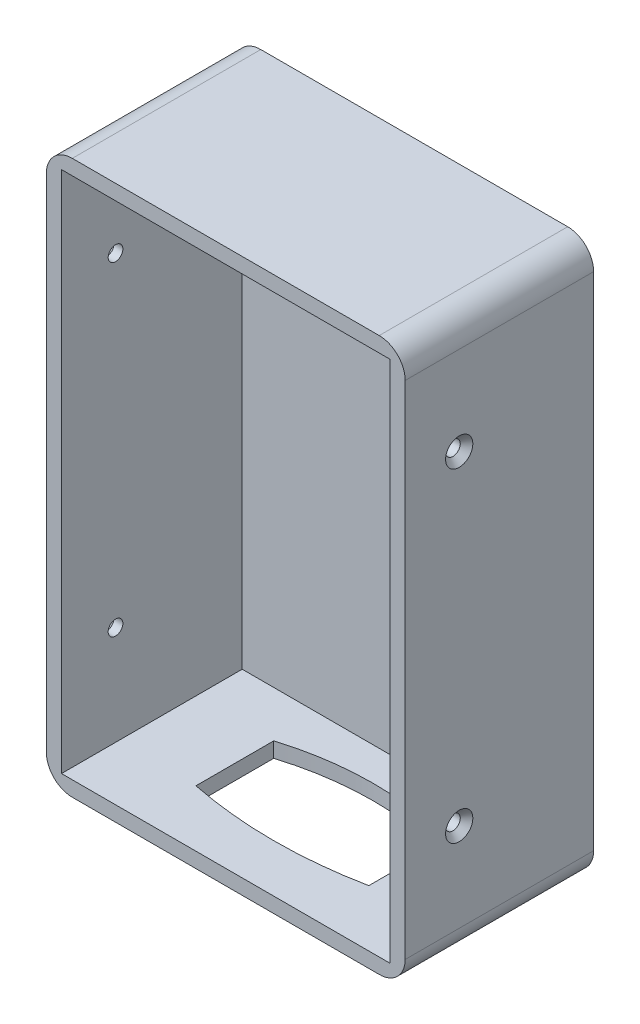
ISO-10303-21;
HEADER;
FILE_DESCRIPTION(('STEP AP214'),'2;1');
FILE_NAME('part.step','',(''),(''),'','','');
FILE_SCHEMA(('AUTOMOTIVE_DESIGN { 1 0 10303 214 1 1 1 1 }'));
ENDSEC;
DATA;
#1=APPLICATION_CONTEXT('core data for automotive mechanical design processes');
#2=APPLICATION_PROTOCOL_DEFINITION('international standard','automotive_design',2000,#1);
#3=PRODUCT_CONTEXT('',#1,'mechanical');
#4=PRODUCT('Part','Part','',(#3));
#5=PRODUCT_RELATED_PRODUCT_CATEGORY('part','',(#4));
#6=PRODUCT_DEFINITION_FORMATION('','',#4);
#7=PRODUCT_DEFINITION_CONTEXT('part definition',#1,'design');
#8=PRODUCT_DEFINITION('design','',#6,#7);
#9=PRODUCT_DEFINITION_SHAPE('','',#8);
#10=(LENGTH_UNIT() NAMED_UNIT(*) SI_UNIT(.MILLI.,.METRE.));
#11=(NAMED_UNIT(*) PLANE_ANGLE_UNIT() SI_UNIT($,.RADIAN.));
#12=(NAMED_UNIT(*) SI_UNIT($,.STERADIAN.) SOLID_ANGLE_UNIT());
#13=UNCERTAINTY_MEASURE_WITH_UNIT(LENGTH_MEASURE(1.E-05),#10,'distance_accuracy_value','');
#14=(GEOMETRIC_REPRESENTATION_CONTEXT(3) GLOBAL_UNCERTAINTY_ASSIGNED_CONTEXT((#13)) GLOBAL_UNIT_ASSIGNED_CONTEXT((#10,
#11,#12)) REPRESENTATION_CONTEXT('',''));
#15=CARTESIAN_POINT('',(0.,0.,0.));
#16=DIRECTION('',(0.,0.,1.));
#17=DIRECTION('',(1.,0.,0.));
#18=AXIS2_PLACEMENT_3D('',#15,#16,#17);
#19=CARTESIAN_POINT('',(-41.5,58.,43.6));
#20=DIRECTION('',(1.,0.,0.));
#21=DIRECTION('',(0.,0.,-1.));
#22=AXIS2_PLACEMENT_3D('',#19,#20,#21);
#23=PLANE('',#22);
#24=DIRECTION('',(0.,-1.,0.));
#25=VECTOR('',#24,1.);
#26=CARTESIAN_POINT('',(-41.5,58.,0.));
#27=LINE('',#26,#25);
#28=CARTESIAN_POINT('',(-41.5,58.,0.));
#29=VERTEX_POINT('',#28);
#30=CARTESIAN_POINT('',(-41.5,-58.,0.));
#31=VERTEX_POINT('',#30);
#32=EDGE_CURVE('E343',#29,#31,#27,.T.);
#33=ORIENTED_EDGE('',*,*,#32,.T.);
#34=DIRECTION('',(0.,0.,-1.));
#35=VECTOR('',#34,1.);
#36=CARTESIAN_POINT('',(-41.5,-58.,43.6));
#37=LINE('',#36,#35);
#38=CARTESIAN_POINT('',(-41.5,-58.,43.6));
#39=VERTEX_POINT('',#38);
#40=EDGE_CURVE('E357',#39,#31,#37,.T.);
#41=ORIENTED_EDGE('',*,*,#40,.F.);
#42=DIRECTION('',(0.,-1.,0.));
#43=VECTOR('',#42,1.);
#44=CARTESIAN_POINT('',(-41.5,58.,43.6));
#45=LINE('',#44,#43);
#46=CARTESIAN_POINT('',(-41.5,58.,43.6));
#47=VERTEX_POINT('',#46);
#48=EDGE_CURVE('E355',#47,#39,#45,.T.);
#49=ORIENTED_EDGE('',*,*,#48,.F.);
#50=DIRECTION('',(0.,0.,-1.));
#51=VECTOR('',#50,1.);
#52=CARTESIAN_POINT('',(-41.5,58.,43.6));
#53=LINE('',#52,#51);
#54=EDGE_CURVE('E375',#47,#29,#53,.T.);
#55=ORIENTED_EDGE('',*,*,#54,.T.);
#56=EDGE_LOOP('',(#33,#41,#49,#55));
#57=FACE_BOUND('',#56,.T.);
#58=CARTESIAN_POINT('',(-41.5,37.5,31.1));
#59=DIRECTION('',(-1.,0.,0.));
#60=DIRECTION('',(0.,0.,1.));
#61=AXIS2_PLACEMENT_3D('',#58,#59,#60);
#62=CIRCLE('',#61,3.15);
#63=CARTESIAN_POINT('',(-41.5,37.5,34.25));
#64=VERTEX_POINT('',#63);
#65=EDGE_CURVE('E250',#64,#64,#62,.T.);
#66=ORIENTED_EDGE('',*,*,#65,.F.);
#67=EDGE_LOOP('',(#66));
#68=FACE_BOUND('',#67,.T.);
#69=CARTESIAN_POINT('',(-41.5,-37.5,31.1));
#70=DIRECTION('',(-1.,0.,0.));
#71=DIRECTION('',(0.,0.,1.));
#72=AXIS2_PLACEMENT_3D('',#69,#70,#71);
#73=CIRCLE('',#72,3.15);
#74=CARTESIAN_POINT('',(-41.5,-37.5,34.25));
#75=VERTEX_POINT('',#74);
#76=EDGE_CURVE('E231',#75,#75,#73,.T.);
#77=ORIENTED_EDGE('',*,*,#76,.F.);
#78=EDGE_LOOP('',(#77));
#79=FACE_BOUND('',#78,.T.);
#80=ADVANCED_FACE('F33',(#57,#68,#79),#23,.F.);
#81=CARTESIAN_POINT('',(41.5,58.,43.6));
#82=DIRECTION('',(-1.,0.,0.));
#83=DIRECTION('',(0.,-1.,0.));
#84=AXIS2_PLACEMENT_3D('',#81,#82,#83);
#85=PLANE('',#84);
#86=CARTESIAN_POINT('',(41.5,37.5,31.1));
#87=DIRECTION('',(1.,0.,0.));
#88=DIRECTION('',(0.,0.,-1.));
#89=AXIS2_PLACEMENT_3D('',#86,#87,#88);
#90=CIRCLE('',#89,3.15);
#91=CARTESIAN_POINT('',(41.5,37.5,27.95));
#92=VERTEX_POINT('',#91);
#93=EDGE_CURVE('E268',#92,#92,#90,.T.);
#94=ORIENTED_EDGE('',*,*,#93,.F.);
#95=EDGE_LOOP('',(#94));
#96=FACE_BOUND('',#95,.T.);
#97=DIRECTION('',(0.,1.,0.));
#98=VECTOR('',#97,1.);
#99=CARTESIAN_POINT('',(41.5,58.,0.));
#100=LINE('',#99,#98);
#101=CARTESIAN_POINT('',(41.5,-58.,0.));
#102=VERTEX_POINT('',#101);
#103=CARTESIAN_POINT('',(41.5,58.,0.));
#104=VERTEX_POINT('',#103);
#105=EDGE_CURVE('E364',#102,#104,#100,.T.);
#106=ORIENTED_EDGE('',*,*,#105,.T.);
#107=DIRECTION('',(0.,0.,-1.));
#108=VECTOR('',#107,1.);
#109=CARTESIAN_POINT('',(41.5,58.,43.6));
#110=LINE('',#109,#108);
#111=CARTESIAN_POINT('',(41.5,58.,43.6));
#112=VERTEX_POINT('',#111);
#113=EDGE_CURVE('E384',#112,#104,#110,.T.);
#114=ORIENTED_EDGE('',*,*,#113,.F.);
#115=DIRECTION('',(0.,1.,0.));
#116=VECTOR('',#115,1.);
#117=CARTESIAN_POINT('',(41.5,58.,43.6));
#118=LINE('',#117,#116);
#119=CARTESIAN_POINT('',(41.5,-58.,43.6));
#120=VERTEX_POINT('',#119);
#121=EDGE_CURVE('E347',#120,#112,#118,.T.);
#122=ORIENTED_EDGE('',*,*,#121,.F.);
#123=DIRECTION('',(0.,0.,-1.));
#124=VECTOR('',#123,1.);
#125=CARTESIAN_POINT('',(41.5,-58.,43.6));
#126=LINE('',#125,#124);
#127=EDGE_CURVE('E387',#120,#102,#126,.T.);
#128=ORIENTED_EDGE('',*,*,#127,.T.);
#129=EDGE_LOOP('',(#106,#114,#122,#128));
#130=FACE_BOUND('',#129,.T.);
#131=CARTESIAN_POINT('',(41.5,-37.5,31.1));
#132=DIRECTION('',(1.,0.,0.));
#133=DIRECTION('',(0.,0.,-1.));
#134=AXIS2_PLACEMENT_3D('',#131,#132,#133);
#135=CIRCLE('',#134,3.15);
#136=CARTESIAN_POINT('',(41.5,-37.5,27.95));
#137=VERTEX_POINT('',#136);
#138=EDGE_CURVE('E259',#137,#137,#135,.T.);
#139=ORIENTED_EDGE('',*,*,#138,.F.);
#140=EDGE_LOOP('',(#139));
#141=FACE_BOUND('',#140,.T.);
#142=ADVANCED_FACE('F448',(#96,#130,#141),#85,.F.);
#143=CARTESIAN_POINT('',(-35.5,-58.,43.6));
#144=DIRECTION('',(0.,0.,1.));
#145=DIRECTION('',(1.,0.,0.));
#146=AXIS2_PLACEMENT_3D('',#143,#144,#145);
#147=PLANE('',#146);
#148=CARTESIAN_POINT('',(-35.5,-58.,43.6));
#149=DIRECTION('',(0.,0.,1.));
#150=DIRECTION('',(1.,0.,0.));
#151=AXIS2_PLACEMENT_3D('',#148,#149,#150);
#152=CIRCLE('',#151,6.);
#153=CARTESIAN_POINT('',(-35.5,-64.,43.6));
#154=VERTEX_POINT('',#153);
#155=EDGE_CURVE('E339',#39,#154,#152,.T.);
#156=ORIENTED_EDGE('',*,*,#155,.T.);
#157=DIRECTION('',(1.,0.,0.));
#158=VECTOR('',#157,1.);
#159=CARTESIAN_POINT('',(-35.5,-64.,43.6));
#160=LINE('',#159,#158);
#161=CARTESIAN_POINT('',(35.5,-64.,43.6));
#162=VERTEX_POINT('',#161);
#163=EDGE_CURVE('E342',#154,#162,#160,.T.);
#164=ORIENTED_EDGE('',*,*,#163,.T.);
#165=CARTESIAN_POINT('',(35.5,-58.,43.6));
#166=DIRECTION('',(0.,0.,1.));
#167=DIRECTION('',(1.,0.,0.));
#168=AXIS2_PLACEMENT_3D('',#165,#166,#167);
#169=CIRCLE('',#168,6.);
#170=EDGE_CURVE('E345',#162,#120,#169,.T.);
#171=ORIENTED_EDGE('',*,*,#170,.T.);
#172=ORIENTED_EDGE('',*,*,#121,.T.);
#173=CARTESIAN_POINT('',(35.5,58.,43.6));
#174=DIRECTION('',(0.,0.,1.));
#175=DIRECTION('',(1.,0.,0.));
#176=AXIS2_PLACEMENT_3D('',#173,#174,#175);
#177=CIRCLE('',#176,5.99999999999999);
#178=CARTESIAN_POINT('',(35.5,64.,43.6));
#179=VERTEX_POINT('',#178);
#180=EDGE_CURVE('E349',#112,#179,#177,.T.);
#181=ORIENTED_EDGE('',*,*,#180,.T.);
#182=DIRECTION('',(-1.,0.,0.));
#183=VECTOR('',#182,1.);
#184=CARTESIAN_POINT('',(-35.5,64.,43.6));
#185=LINE('',#184,#183);
#186=CARTESIAN_POINT('',(-35.5,64.,43.6));
#187=VERTEX_POINT('',#186);
#188=EDGE_CURVE('E351',#179,#187,#185,.T.);
#189=ORIENTED_EDGE('',*,*,#188,.T.);
#190=CARTESIAN_POINT('',(-35.5,58.,43.6));
#191=DIRECTION('',(0.,0.,1.));
#192=DIRECTION('',(-1.,0.,0.));
#193=AXIS2_PLACEMENT_3D('',#190,#191,#192);
#194=CIRCLE('',#193,5.99999999999999);
#195=EDGE_CURVE('E353',#187,#47,#194,.T.);
#196=ORIENTED_EDGE('',*,*,#195,.T.);
#197=ORIENTED_EDGE('',*,*,#48,.T.);
#198=EDGE_LOOP('',(#156,#164,#171,#172,#181,#189,#196,#197));
#199=FACE_BOUND('',#198,.T.);
#200=DIRECTION('',(-1.,0.,0.));
#201=VECTOR('',#200,1.);
#202=CARTESIAN_POINT('',(-38.,60.5,43.6));
#203=LINE('',#202,#201);
#204=CARTESIAN_POINT('',(38.,60.5,43.6));
#205=VERTEX_POINT('',#204);
#206=CARTESIAN_POINT('',(-38.,60.5,43.6));
#207=VERTEX_POINT('',#206);
#208=EDGE_CURVE('E320',#205,#207,#203,.T.);
#209=ORIENTED_EDGE('',*,*,#208,.F.);
#210=DIRECTION('',(0.,1.,0.));
#211=VECTOR('',#210,1.);
#212=CARTESIAN_POINT('',(38.,60.5,43.6));
#213=LINE('',#212,#211);
#214=CARTESIAN_POINT('',(38.,-60.5,43.6));
#215=VERTEX_POINT('',#214);
#216=EDGE_CURVE('E318',#215,#205,#213,.T.);
#217=ORIENTED_EDGE('',*,*,#216,.F.);
#218=DIRECTION('',(1.,0.,0.));
#219=VECTOR('',#218,1.);
#220=CARTESIAN_POINT('',(-38.,-60.5,43.6));
#221=LINE('',#220,#219);
#222=CARTESIAN_POINT('',(-38.,-60.5,43.6));
#223=VERTEX_POINT('',#222);
#224=EDGE_CURVE('E325',#223,#215,#221,.T.);
#225=ORIENTED_EDGE('',*,*,#224,.F.);
#226=DIRECTION('',(0.,-1.,0.));
#227=VECTOR('',#226,1.);
#228=CARTESIAN_POINT('',(-38.,60.5,43.6));
#229=LINE('',#228,#227);
#230=EDGE_CURVE('E322',#207,#223,#229,.T.);
#231=ORIENTED_EDGE('',*,*,#230,.F.);
#232=EDGE_LOOP('',(#209,#217,#225,#231));
#233=FACE_BOUND('',#232,.T.);
#234=ADVANCED_FACE('F454',(#199,#233),#147,.T.);
#235=CARTESIAN_POINT('',(-35.5,-58.,0.));
#236=DIRECTION('',(0.,0.,1.));
#237=DIRECTION('',(1.,0.,0.));
#238=AXIS2_PLACEMENT_3D('',#235,#236,#237);
#239=PLANE('',#238);
#240=DIRECTION('',(-1.,0.,0.));
#241=VECTOR('',#240,1.);
#242=CARTESIAN_POINT('',(7.99999999999999,44.,0.));
#243=LINE('',#242,#241);
#244=CARTESIAN_POINT('',(7.99999999999999,44.,0.));
#245=VERTEX_POINT('',#244);
#246=CARTESIAN_POINT('',(-7.99999999999999,44.,0.));
#247=VERTEX_POINT('',#246);
#248=EDGE_CURVE('E205',#245,#247,#243,.T.);
#249=ORIENTED_EDGE('',*,*,#248,.F.);
#250=CARTESIAN_POINT('',(8.,46.,0.));
#251=DIRECTION('',(0.,0.,-1.));
#252=DIRECTION('',(-1.,0.,0.));
#253=AXIS2_PLACEMENT_3D('',#250,#251,#252);
#254=CIRCLE('',#253,2.);
#255=CARTESIAN_POINT('',(10.,46.,0.));
#256=VERTEX_POINT('',#255);
#257=EDGE_CURVE('E48',#256,#245,#254,.T.);
#258=ORIENTED_EDGE('',*,*,#257,.F.);
#259=DIRECTION('',(0.,-1.,0.));
#260=VECTOR('',#259,1.);
#261=CARTESIAN_POINT('',(10.,52.,0.));
#262=LINE('',#261,#260);
#263=CARTESIAN_POINT('',(10.,52.,0.));
#264=VERTEX_POINT('',#263);
#265=EDGE_CURVE('E226',#264,#256,#262,.T.);
#266=ORIENTED_EDGE('',*,*,#265,.F.);
#267=CARTESIAN_POINT('',(8.,52.,0.));
#268=DIRECTION('',(0.,0.,-1.));
#269=DIRECTION('',(-1.,0.,0.));
#270=AXIS2_PLACEMENT_3D('',#267,#268,#269);
#271=CIRCLE('',#270,2.);
#272=CARTESIAN_POINT('',(7.99999999999999,54.,0.));
#273=VERTEX_POINT('',#272);
#274=EDGE_CURVE('E223',#273,#264,#271,.T.);
#275=ORIENTED_EDGE('',*,*,#274,.F.);
#276=DIRECTION('',(-1.,0.,0.));
#277=VECTOR('',#276,1.);
#278=CARTESIAN_POINT('',(7.99999999999999,54.,0.));
#279=LINE('',#278,#277);
#280=CARTESIAN_POINT('',(-7.99999999999998,54.,0.));
#281=VERTEX_POINT('',#280);
#282=EDGE_CURVE('E220',#273,#281,#279,.T.);
#283=ORIENTED_EDGE('',*,*,#282,.T.);
#284=CARTESIAN_POINT('',(-8.,52.,0.));
#285=DIRECTION('',(0.,0.,1.));
#286=DIRECTION('',(1.,0.,0.));
#287=AXIS2_PLACEMENT_3D('',#284,#285,#286);
#288=CIRCLE('',#287,2.);
#289=CARTESIAN_POINT('',(-10.,52.,0.));
#290=VERTEX_POINT('',#289);
#291=EDGE_CURVE('E215',#281,#290,#288,.T.);
#292=ORIENTED_EDGE('',*,*,#291,.T.);
#293=DIRECTION('',(0.,-1.,0.));
#294=VECTOR('',#293,1.);
#295=CARTESIAN_POINT('',(-10.,52.,0.));
#296=LINE('',#295,#294);
#297=CARTESIAN_POINT('',(-10.,46.,0.));
#298=VERTEX_POINT('',#297);
#299=EDGE_CURVE('E213',#290,#298,#296,.T.);
#300=ORIENTED_EDGE('',*,*,#299,.T.);
#301=CARTESIAN_POINT('',(-8.,46.,0.));
#302=DIRECTION('',(0.,0.,-1.));
#303=DIRECTION('',(-1.,0.,0.));
#304=AXIS2_PLACEMENT_3D('',#301,#302,#303);
#305=CIRCLE('',#304,2.);
#306=EDGE_CURVE('E196',#247,#298,#305,.T.);
#307=ORIENTED_EDGE('',*,*,#306,.F.);
#308=EDGE_LOOP('',(#249,#258,#266,#275,#283,#292,#300,#307));
#309=FACE_BOUND('',#308,.T.);
#310=CARTESIAN_POINT('',(-35.5,-58.,0.));
#311=DIRECTION('',(0.,0.,1.));
#312=DIRECTION('',(1.,0.,0.));
#313=AXIS2_PLACEMENT_3D('',#310,#311,#312);
#314=CIRCLE('',#313,6.);
#315=CARTESIAN_POINT('',(-35.5,-64.,0.));
#316=VERTEX_POINT('',#315);
#317=EDGE_CURVE('E338',#31,#316,#314,.T.);
#318=ORIENTED_EDGE('',*,*,#317,.F.);
#319=ORIENTED_EDGE('',*,*,#32,.F.);
#320=CARTESIAN_POINT('',(-35.5,58.,0.));
#321=DIRECTION('',(0.,0.,1.));
#322=DIRECTION('',(-1.,0.,0.));
#323=AXIS2_PLACEMENT_3D('',#320,#321,#322);
#324=CIRCLE('',#323,5.99999999999999);
#325=CARTESIAN_POINT('',(-35.5,64.,0.));
#326=VERTEX_POINT('',#325);
#327=EDGE_CURVE('E370',#326,#29,#324,.T.);
#328=ORIENTED_EDGE('',*,*,#327,.F.);
#329=DIRECTION('',(-1.,0.,0.));
#330=VECTOR('',#329,1.);
#331=CARTESIAN_POINT('',(-35.5,64.,0.));
#332=LINE('',#331,#330);
#333=CARTESIAN_POINT('',(35.5,64.,0.));
#334=VERTEX_POINT('',#333);
#335=EDGE_CURVE('E368',#334,#326,#332,.T.);
#336=ORIENTED_EDGE('',*,*,#335,.F.);
#337=CARTESIAN_POINT('',(35.5,58.,0.));
#338=DIRECTION('',(0.,0.,1.));
#339=DIRECTION('',(1.,0.,0.));
#340=AXIS2_PLACEMENT_3D('',#337,#338,#339);
#341=CIRCLE('',#340,5.99999999999999);
#342=EDGE_CURVE('E366',#104,#334,#341,.T.);
#343=ORIENTED_EDGE('',*,*,#342,.F.);
#344=ORIENTED_EDGE('',*,*,#105,.F.);
#345=CARTESIAN_POINT('',(35.5,-58.,0.));
#346=DIRECTION('',(0.,0.,1.));
#347=DIRECTION('',(1.,0.,0.));
#348=AXIS2_PLACEMENT_3D('',#345,#346,#347);
#349=CIRCLE('',#348,6.);
#350=CARTESIAN_POINT('',(35.5,-64.,0.));
#351=VERTEX_POINT('',#350);
#352=EDGE_CURVE('E362',#351,#102,#349,.T.);
#353=ORIENTED_EDGE('',*,*,#352,.F.);
#354=DIRECTION('',(1.,0.,0.));
#355=VECTOR('',#354,1.);
#356=CARTESIAN_POINT('',(-35.5,-64.,0.));
#357=LINE('',#356,#355);
#358=EDGE_CURVE('E360',#316,#351,#357,.T.);
#359=ORIENTED_EDGE('',*,*,#358,.F.);
#360=EDGE_LOOP('',(#318,#319,#328,#336,#343,#344,#353,#359));
#361=FACE_BOUND('',#360,.T.);
#362=ADVANCED_FACE('F209',(#309,#361),#239,.F.);
#363=CARTESIAN_POINT('',(-35.5,-58.,43.6));
#364=DIRECTION('',(0.,0.,-1.));
#365=DIRECTION('',(-1.,0.,0.));
#366=AXIS2_PLACEMENT_3D('',#363,#364,#365);
#367=CYLINDRICAL_SURFACE('',#366,6.);
#368=ORIENTED_EDGE('',*,*,#317,.T.);
#369=DIRECTION('',(0.,0.,-1.));
#370=VECTOR('',#369,1.);
#371=CARTESIAN_POINT('',(-35.5,-64.,43.6));
#372=LINE('',#371,#370);
#373=EDGE_CURVE('E393',#154,#316,#372,.T.);
#374=ORIENTED_EDGE('',*,*,#373,.F.);
#375=ORIENTED_EDGE('',*,*,#155,.F.);
#376=ORIENTED_EDGE('',*,*,#40,.T.);
#377=EDGE_LOOP('',(#368,#374,#375,#376));
#378=FACE_BOUND('',#377,.T.);
#379=ADVANCED_FACE('F35',(#378),#367,.T.);
#380=CARTESIAN_POINT('',(-35.5,-64.,43.6));
#381=DIRECTION('',(0.,1.,0.));
#382=DIRECTION('',(0.,0.,1.));
#383=AXIS2_PLACEMENT_3D('',#380,#381,#382);
#384=PLANE('',#383);
#385=DIRECTION('',(0.,0.,1.));
#386=VECTOR('',#385,1.);
#387=CARTESIAN_POINT('',(20.,-64.,0.));
#388=LINE('',#387,#386);
#389=CARTESIAN_POINT('',(20.,-64.,12.5));
#390=VERTEX_POINT('',#389);
#391=CARTESIAN_POINT('',(20.,-64.,30.5));
#392=VERTEX_POINT('',#391);
#393=EDGE_CURVE('E291',#390,#392,#388,.T.);
#394=ORIENTED_EDGE('',*,*,#393,.F.);
#395=CARTESIAN_POINT('',(0.,-64.,77.6666666666665));
#396=DIRECTION('',(0.,-1.,0.));
#397=DIRECTION('',(0.,0.,-1.));
#398=AXIS2_PLACEMENT_3D('',#395,#396,#397);
#399=CIRCLE('',#398,68.1666666666666);
#400=CARTESIAN_POINT('',(-20.,-64.,12.5));
#401=VERTEX_POINT('',#400);
#402=EDGE_CURVE('E288',#401,#390,#399,.T.);
#403=ORIENTED_EDGE('',*,*,#402,.F.);
#404=DIRECTION('',(0.,0.,-1.));
#405=VECTOR('',#404,1.);
#406=CARTESIAN_POINT('',(-20.,-64.,0.));
#407=LINE('',#406,#405);
#408=CARTESIAN_POINT('',(-20.,-64.,30.5));
#409=VERTEX_POINT('',#408);
#410=EDGE_CURVE('E285',#409,#401,#407,.T.);
#411=ORIENTED_EDGE('',*,*,#410,.F.);
#412=CARTESIAN_POINT('',(0.,-64.,-68.5000000000001));
#413=DIRECTION('',(0.,-1.,0.));
#414=DIRECTION('',(0.,0.,-1.));
#415=AXIS2_PLACEMENT_3D('',#412,#413,#414);
#416=CIRCLE('',#415,101.);
#417=EDGE_CURVE('E294',#409,#392,#416,.F.);
#418=ORIENTED_EDGE('',*,*,#417,.T.);
#419=EDGE_LOOP('',(#394,#403,#411,#418));
#420=FACE_BOUND('',#419,.T.);
#421=ORIENTED_EDGE('',*,*,#358,.T.);
#422=DIRECTION('',(0.,0.,-1.));
#423=VECTOR('',#422,1.);
#424=CARTESIAN_POINT('',(35.5,-64.,43.6));
#425=LINE('',#424,#423);
#426=EDGE_CURVE('E390',#162,#351,#425,.T.);
#427=ORIENTED_EDGE('',*,*,#426,.F.);
#428=ORIENTED_EDGE('',*,*,#163,.F.);
#429=ORIENTED_EDGE('',*,*,#373,.T.);
#430=EDGE_LOOP('',(#421,#427,#428,#429));
#431=FACE_BOUND('',#430,.T.);
#432=ADVANCED_FACE('F476',(#420,#431),#384,.F.);
#433=CARTESIAN_POINT('',(35.5,-58.,43.6));
#434=DIRECTION('',(0.,0.,-1.));
#435=DIRECTION('',(-1.,0.,0.));
#436=AXIS2_PLACEMENT_3D('',#433,#434,#435);
#437=CYLINDRICAL_SURFACE('',#436,6.);
#438=ORIENTED_EDGE('',*,*,#352,.T.);
#439=ORIENTED_EDGE('',*,*,#127,.F.);
#440=ORIENTED_EDGE('',*,*,#170,.F.);
#441=ORIENTED_EDGE('',*,*,#426,.T.);
#442=EDGE_LOOP('',(#438,#439,#440,#441));
#443=FACE_BOUND('',#442,.T.);
#444=ADVANCED_FACE('F472',(#443),#437,.T.);
#445=CARTESIAN_POINT('',(35.5,58.,43.6));
#446=DIRECTION('',(0.,0.,-1.));
#447=DIRECTION('',(-1.,0.,0.));
#448=AXIS2_PLACEMENT_3D('',#445,#446,#447);
#449=CYLINDRICAL_SURFACE('',#448,5.99999999999999);
#450=ORIENTED_EDGE('',*,*,#342,.T.);
#451=DIRECTION('',(0.,0.,-1.));
#452=VECTOR('',#451,1.);
#453=CARTESIAN_POINT('',(35.5,64.,43.6));
#454=LINE('',#453,#452);
#455=EDGE_CURVE('E381',#179,#334,#454,.T.);
#456=ORIENTED_EDGE('',*,*,#455,.F.);
#457=ORIENTED_EDGE('',*,*,#180,.F.);
#458=ORIENTED_EDGE('',*,*,#113,.T.);
#459=EDGE_LOOP('',(#450,#456,#457,#458));
#460=FACE_BOUND('',#459,.T.);
#461=ADVANCED_FACE('F469',(#460),#449,.T.);
#462=CARTESIAN_POINT('',(-35.5,64.,43.6));
#463=DIRECTION('',(0.,-1.,0.));
#464=DIRECTION('',(0.,0.,-1.));
#465=AXIS2_PLACEMENT_3D('',#462,#463,#464);
#466=PLANE('',#465);
#467=ORIENTED_EDGE('',*,*,#335,.T.);
#468=DIRECTION('',(0.,0.,-1.));
#469=VECTOR('',#468,1.);
#470=CARTESIAN_POINT('',(-35.5,64.,43.6));
#471=LINE('',#470,#469);
#472=EDGE_CURVE('E378',#187,#326,#471,.T.);
#473=ORIENTED_EDGE('',*,*,#472,.F.);
#474=ORIENTED_EDGE('',*,*,#188,.F.);
#475=ORIENTED_EDGE('',*,*,#455,.T.);
#476=EDGE_LOOP('',(#467,#473,#474,#475));
#477=FACE_BOUND('',#476,.T.);
#478=ADVANCED_FACE('F465',(#477),#466,.F.);
#479=CARTESIAN_POINT('',(-35.5,58.,43.6));
#480=DIRECTION('',(0.,0.,-1.));
#481=DIRECTION('',(-1.,0.,0.));
#482=AXIS2_PLACEMENT_3D('',#479,#480,#481);
#483=CYLINDRICAL_SURFACE('',#482,5.99999999999999);
#484=ORIENTED_EDGE('',*,*,#327,.T.);
#485=ORIENTED_EDGE('',*,*,#54,.F.);
#486=ORIENTED_EDGE('',*,*,#195,.F.);
#487=ORIENTED_EDGE('',*,*,#472,.T.);
#488=EDGE_LOOP('',(#484,#485,#486,#487));
#489=FACE_BOUND('',#488,.T.);
#490=ADVANCED_FACE('F461',(#489),#483,.T.);
#491=CARTESIAN_POINT('',(38.,60.5,43.6));
#492=DIRECTION('',(-1.,0.,0.));
#493=DIRECTION('',(0.,-1.,0.));
#494=AXIS2_PLACEMENT_3D('',#491,#492,#493);
#495=PLANE('',#494);
#496=CARTESIAN_POINT('',(38.,-37.5,31.1));
#497=DIRECTION('',(-1.,0.,0.));
#498=DIRECTION('',(0.,-1.,0.));
#499=AXIS2_PLACEMENT_3D('',#496,#497,#498);
#500=CIRCLE('',#499,1.69999999999999);
#501=CARTESIAN_POINT('',(38.,-39.2,31.1));
#502=VERTEX_POINT('',#501);
#503=EDGE_CURVE('E265',#502,#502,#500,.T.);
#504=ORIENTED_EDGE('',*,*,#503,.F.);
#505=EDGE_LOOP('',(#504));
#506=FACE_BOUND('',#505,.T.);
#507=CARTESIAN_POINT('',(38.,37.5,31.1));
#508=DIRECTION('',(-1.,0.,0.));
#509=DIRECTION('',(0.,-1.,0.));
#510=AXIS2_PLACEMENT_3D('',#507,#508,#509);
#511=CIRCLE('',#510,1.69999999999999);
#512=CARTESIAN_POINT('',(38.,35.8,31.1));
#513=VERTEX_POINT('',#512);
#514=EDGE_CURVE('E274',#513,#513,#511,.T.);
#515=ORIENTED_EDGE('',*,*,#514,.F.);
#516=EDGE_LOOP('',(#515));
#517=FACE_BOUND('',#516,.T.);
#518=DIRECTION('',(0.,-1.,0.));
#519=VECTOR('',#518,1.);
#520=CARTESIAN_POINT('',(38.,60.5,1.8));
#521=LINE('',#520,#519);
#522=CARTESIAN_POINT('',(38.,60.5,1.8));
#523=VERTEX_POINT('',#522);
#524=CARTESIAN_POINT('',(38.,-60.5,1.8));
#525=VERTEX_POINT('',#524);
#526=EDGE_CURVE('E309',#523,#525,#521,.T.);
#527=ORIENTED_EDGE('',*,*,#526,.T.);
#528=DIRECTION('',(0.,0.,-1.));
#529=VECTOR('',#528,1.);
#530=CARTESIAN_POINT('',(38.,-60.5,43.6));
#531=LINE('',#530,#529);
#532=EDGE_CURVE('E327',#215,#525,#531,.T.);
#533=ORIENTED_EDGE('',*,*,#532,.F.);
#534=ORIENTED_EDGE('',*,*,#216,.T.);
#535=DIRECTION('',(0.,0.,-1.));
#536=VECTOR('',#535,1.);
#537=CARTESIAN_POINT('',(38.,60.5,43.6));
#538=LINE('',#537,#536);
#539=EDGE_CURVE('E335',#205,#523,#538,.T.);
#540=ORIENTED_EDGE('',*,*,#539,.T.);
#541=EDGE_LOOP('',(#527,#533,#534,#540));
#542=FACE_BOUND('',#541,.T.);
#543=ADVANCED_FACE('F464',(#506,#517,#542),#495,.T.);
#544=CARTESIAN_POINT('',(-38.,60.5,43.6));
#545=DIRECTION('',(0.,-1.,0.));
#546=DIRECTION('',(0.,0.,-1.));
#547=AXIS2_PLACEMENT_3D('',#544,#545,#546);
#548=PLANE('',#547);
#549=DIRECTION('',(1.,0.,0.));
#550=VECTOR('',#549,1.);
#551=CARTESIAN_POINT('',(-38.,60.5,1.8));
#552=LINE('',#551,#550);
#553=CARTESIAN_POINT('',(-38.,60.5,1.8));
#554=VERTEX_POINT('',#553);
#555=EDGE_CURVE('E316',#554,#523,#552,.T.);
#556=ORIENTED_EDGE('',*,*,#555,.T.);
#557=ORIENTED_EDGE('',*,*,#539,.F.);
#558=ORIENTED_EDGE('',*,*,#208,.T.);
#559=DIRECTION('',(0.,0.,-1.));
#560=VECTOR('',#559,1.);
#561=CARTESIAN_POINT('',(-38.,60.5,43.6));
#562=LINE('',#561,#560);
#563=EDGE_CURVE('E332',#207,#554,#562,.T.);
#564=ORIENTED_EDGE('',*,*,#563,.T.);
#565=EDGE_LOOP('',(#556,#557,#558,#564));
#566=FACE_BOUND('',#565,.T.);
#567=ADVANCED_FACE('F521',(#566),#548,.T.);
#568=CARTESIAN_POINT('',(-38.,60.5,43.6));
#569=DIRECTION('',(1.,0.,0.));
#570=DIRECTION('',(0.,1.,0.));
#571=AXIS2_PLACEMENT_3D('',#568,#569,#570);
#572=PLANE('',#571);
#573=CARTESIAN_POINT('',(-38.,-37.5,31.1));
#574=DIRECTION('',(1.,0.,0.));
#575=DIRECTION('',(0.,1.,0.));
#576=AXIS2_PLACEMENT_3D('',#573,#574,#575);
#577=CIRCLE('',#576,1.7);
#578=CARTESIAN_POINT('',(-38.,-35.8,31.1));
#579=VERTEX_POINT('',#578);
#580=EDGE_CURVE('E247',#579,#579,#577,.T.);
#581=ORIENTED_EDGE('',*,*,#580,.F.);
#582=EDGE_LOOP('',(#581));
#583=FACE_BOUND('',#582,.T.);
#584=CARTESIAN_POINT('',(-38.,37.5,31.1));
#585=DIRECTION('',(1.,0.,0.));
#586=DIRECTION('',(0.,1.,0.));
#587=AXIS2_PLACEMENT_3D('',#584,#585,#586);
#588=CIRCLE('',#587,1.7);
#589=CARTESIAN_POINT('',(-38.,39.2,31.1));
#590=VERTEX_POINT('',#589);
#591=EDGE_CURVE('E256',#590,#590,#588,.T.);
#592=ORIENTED_EDGE('',*,*,#591,.F.);
#593=EDGE_LOOP('',(#592));
#594=FACE_BOUND('',#593,.T.);
#595=DIRECTION('',(0.,1.,0.));
#596=VECTOR('',#595,1.);
#597=CARTESIAN_POINT('',(-38.,60.5,1.8));
#598=LINE('',#597,#596);
#599=CARTESIAN_POINT('',(-38.,-60.5,1.8));
#600=VERTEX_POINT('',#599);
#601=EDGE_CURVE('E314',#600,#554,#598,.T.);
#602=ORIENTED_EDGE('',*,*,#601,.T.);
#603=ORIENTED_EDGE('',*,*,#563,.F.);
#604=ORIENTED_EDGE('',*,*,#230,.T.);
#605=DIRECTION('',(0.,0.,-1.));
#606=VECTOR('',#605,1.);
#607=CARTESIAN_POINT('',(-38.,-60.5,43.6));
#608=LINE('',#607,#606);
#609=EDGE_CURVE('E329',#223,#600,#608,.T.);
#610=ORIENTED_EDGE('',*,*,#609,.T.);
#611=EDGE_LOOP('',(#602,#603,#604,#610));
#612=FACE_BOUND('',#611,.T.);
#613=ADVANCED_FACE('F524',(#583,#594,#612),#572,.T.);
#614=CARTESIAN_POINT('',(-38.,-60.5,43.6));
#615=DIRECTION('',(0.,1.,0.));
#616=DIRECTION('',(0.,0.,1.));
#617=AXIS2_PLACEMENT_3D('',#614,#615,#616);
#618=PLANE('',#617);
#619=CARTESIAN_POINT('',(0.,-60.5,77.6666666666665));
#620=DIRECTION('',(0.,1.,0.));
#621=DIRECTION('',(0.,0.,1.));
#622=AXIS2_PLACEMENT_3D('',#619,#620,#621);
#623=CIRCLE('',#622,68.1666666666666);
#624=CARTESIAN_POINT('',(-20.,-60.5,12.5));
#625=VERTEX_POINT('',#624);
#626=CARTESIAN_POINT('',(20.,-60.5,12.5));
#627=VERTEX_POINT('',#626);
#628=EDGE_CURVE('E301',#625,#627,#623,.F.);
#629=ORIENTED_EDGE('',*,*,#628,.T.);
#630=DIRECTION('',(0.,0.,1.));
#631=VECTOR('',#630,1.);
#632=CARTESIAN_POINT('',(20.,-60.5,0.));
#633=LINE('',#632,#631);
#634=CARTESIAN_POINT('',(20.,-60.5,30.5));
#635=VERTEX_POINT('',#634);
#636=EDGE_CURVE('E277',#627,#635,#633,.T.);
#637=ORIENTED_EDGE('',*,*,#636,.T.);
#638=CARTESIAN_POINT('',(0.,-60.5,-68.5000000000001));
#639=DIRECTION('',(0.,1.,0.));
#640=DIRECTION('',(0.,0.,1.));
#641=AXIS2_PLACEMENT_3D('',#638,#639,#640);
#642=CIRCLE('',#641,101.);
#643=CARTESIAN_POINT('',(-20.,-60.5,30.5));
#644=VERTEX_POINT('',#643);
#645=EDGE_CURVE('E280',#644,#635,#642,.T.);
#646=ORIENTED_EDGE('',*,*,#645,.F.);
#647=DIRECTION('',(0.,0.,-1.));
#648=VECTOR('',#647,1.);
#649=CARTESIAN_POINT('',(-20.,-60.5,0.));
#650=LINE('',#649,#648);
#651=EDGE_CURVE('E282',#644,#625,#650,.T.);
#652=ORIENTED_EDGE('',*,*,#651,.T.);
#653=EDGE_LOOP('',(#629,#637,#646,#652));
#654=FACE_BOUND('',#653,.T.);
#655=DIRECTION('',(-1.,0.,0.));
#656=VECTOR('',#655,1.);
#657=CARTESIAN_POINT('',(-38.,-60.5,1.8));
#658=LINE('',#657,#656);
#659=EDGE_CURVE('E312',#525,#600,#658,.T.);
#660=ORIENTED_EDGE('',*,*,#659,.T.);
#661=ORIENTED_EDGE('',*,*,#609,.F.);
#662=ORIENTED_EDGE('',*,*,#224,.T.);
#663=ORIENTED_EDGE('',*,*,#532,.T.);
#664=EDGE_LOOP('',(#660,#661,#662,#663));
#665=FACE_BOUND('',#664,.T.);
#666=ADVANCED_FACE('F531',(#654,#665),#618,.T.);
#667=CARTESIAN_POINT('',(0.,0.,1.8));
#668=DIRECTION('',(0.,0.,1.));
#669=DIRECTION('',(1.,0.,0.));
#670=AXIS2_PLACEMENT_3D('',#667,#668,#669);
#671=PLANE('',#670);
#672=CARTESIAN_POINT('',(8.,46.,1.8));
#673=DIRECTION('',(0.,0.,1.));
#674=DIRECTION('',(1.,0.,0.));
#675=AXIS2_PLACEMENT_3D('',#672,#673,#674);
#676=CIRCLE('',#675,2.);
#677=CARTESIAN_POINT('',(7.99999999999999,44.,1.8));
#678=VERTEX_POINT('',#677);
#679=CARTESIAN_POINT('',(10.,46.,1.8));
#680=VERTEX_POINT('',#679);
#681=EDGE_CURVE('E11',#678,#680,#676,.T.);
#682=ORIENTED_EDGE('',*,*,#681,.F.);
#683=DIRECTION('',(1.,0.,0.));
#684=VECTOR('',#683,1.);
#685=CARTESIAN_POINT('',(0.,44.,1.8));
#686=LINE('',#685,#684);
#687=CARTESIAN_POINT('',(-7.99999999999999,44.,1.8));
#688=VERTEX_POINT('',#687);
#689=EDGE_CURVE('E396',#688,#678,#686,.T.);
#690=ORIENTED_EDGE('',*,*,#689,.F.);
#691=CARTESIAN_POINT('',(-8.,46.,1.8));
#692=DIRECTION('',(0.,0.,1.));
#693=DIRECTION('',(1.,0.,0.));
#694=AXIS2_PLACEMENT_3D('',#691,#692,#693);
#695=CIRCLE('',#694,2.);
#696=CARTESIAN_POINT('',(-10.,46.,1.8));
#697=VERTEX_POINT('',#696);
#698=EDGE_CURVE('E199',#697,#688,#695,.T.);
#699=ORIENTED_EDGE('',*,*,#698,.F.);
#700=DIRECTION('',(0.,1.,0.));
#701=VECTOR('',#700,1.);
#702=CARTESIAN_POINT('',(-10.,0.,1.8));
#703=LINE('',#702,#701);
#704=CARTESIAN_POINT('',(-10.,52.,1.8));
#705=VERTEX_POINT('',#704);
#706=EDGE_CURVE('E399',#697,#705,#703,.T.);
#707=ORIENTED_EDGE('',*,*,#706,.T.);
#708=CARTESIAN_POINT('',(-8.,52.,1.8));
#709=DIRECTION('',(0.,0.,1.));
#710=DIRECTION('',(1.,0.,0.));
#711=AXIS2_PLACEMENT_3D('',#708,#709,#710);
#712=CIRCLE('',#711,2.);
#713=CARTESIAN_POINT('',(-7.99999999999998,54.,1.8));
#714=VERTEX_POINT('',#713);
#715=EDGE_CURVE('E402',#705,#714,#712,.F.);
#716=ORIENTED_EDGE('',*,*,#715,.T.);
#717=DIRECTION('',(1.,0.,0.));
#718=VECTOR('',#717,1.);
#719=CARTESIAN_POINT('',(0.,54.,1.8));
#720=LINE('',#719,#718);
#721=CARTESIAN_POINT('',(7.99999999999999,54.,1.8));
#722=VERTEX_POINT('',#721);
#723=EDGE_CURVE('E405',#714,#722,#720,.T.);
#724=ORIENTED_EDGE('',*,*,#723,.T.);
#725=CARTESIAN_POINT('',(8.,52.,1.8));
#726=DIRECTION('',(0.,0.,1.));
#727=DIRECTION('',(1.,0.,0.));
#728=AXIS2_PLACEMENT_3D('',#725,#726,#727);
#729=CIRCLE('',#728,2.);
#730=CARTESIAN_POINT('',(10.,52.,1.8));
#731=VERTEX_POINT('',#730);
#732=EDGE_CURVE('E408',#731,#722,#729,.T.);
#733=ORIENTED_EDGE('',*,*,#732,.F.);
#734=DIRECTION('',(0.,1.,0.));
#735=VECTOR('',#734,1.);
#736=CARTESIAN_POINT('',(9.99999999999999,0.,1.8));
#737=LINE('',#736,#735);
#738=EDGE_CURVE('E41',#680,#731,#737,.T.);
#739=ORIENTED_EDGE('',*,*,#738,.F.);
#740=EDGE_LOOP('',(#682,#690,#699,#707,#716,#724,#733,#739));
#741=FACE_BOUND('',#740,.T.);
#742=ORIENTED_EDGE('',*,*,#526,.F.);
#743=ORIENTED_EDGE('',*,*,#555,.F.);
#744=ORIENTED_EDGE('',*,*,#601,.F.);
#745=ORIENTED_EDGE('',*,*,#659,.F.);
#746=EDGE_LOOP('',(#742,#743,#744,#745));
#747=FACE_BOUND('',#746,.T.);
#748=ADVANCED_FACE('F422',(#741,#747),#671,.T.);
#749=CARTESIAN_POINT('',(0.,64.001,77.6666666666665));
#750=DIRECTION('',(0.,-1.,0.));
#751=DIRECTION('',(0.,0.,-1.));
#752=AXIS2_PLACEMENT_3D('',#749,#750,#751);
#753=CYLINDRICAL_SURFACE('',#752,68.1666666666666);
#754=DIRECTION('',(0.,-1.,0.));
#755=VECTOR('',#754,1.);
#756=CARTESIAN_POINT('',(-20.,64.001,12.5));
#757=LINE('',#756,#755);
#758=EDGE_CURVE('E297',#625,#401,#757,.T.);
#759=ORIENTED_EDGE('',*,*,#758,.T.);
#760=ORIENTED_EDGE('',*,*,#402,.T.);
#761=DIRECTION('',(0.,-1.,0.));
#762=VECTOR('',#761,1.);
#763=CARTESIAN_POINT('',(20.,64.001,12.5));
#764=LINE('',#763,#762);
#765=EDGE_CURVE('E304',#627,#390,#764,.T.);
#766=ORIENTED_EDGE('',*,*,#765,.F.);
#767=ORIENTED_EDGE('',*,*,#628,.F.);
#768=EDGE_LOOP('',(#759,#760,#766,#767));
#769=FACE_BOUND('',#768,.T.);
#770=ADVANCED_FACE('F539',(#769),#753,.F.);
#771=CARTESIAN_POINT('',(20.,64.001,0.));
#772=DIRECTION('',(1.,0.,0.));
#773=DIRECTION('',(0.,0.,-1.));
#774=AXIS2_PLACEMENT_3D('',#771,#772,#773);
#775=PLANE('',#774);
#776=ORIENTED_EDGE('',*,*,#765,.T.);
#777=ORIENTED_EDGE('',*,*,#393,.T.);
#778=DIRECTION('',(0.,-1.,0.));
#779=VECTOR('',#778,1.);
#780=CARTESIAN_POINT('',(20.,64.001,30.5));
#781=LINE('',#780,#779);
#782=EDGE_CURVE('E302',#635,#392,#781,.T.);
#783=ORIENTED_EDGE('',*,*,#782,.F.);
#784=ORIENTED_EDGE('',*,*,#636,.F.);
#785=EDGE_LOOP('',(#776,#777,#783,#784));
#786=FACE_BOUND('',#785,.T.);
#787=ADVANCED_FACE('F574',(#786),#775,.F.);
#788=CARTESIAN_POINT('',(0.,64.001,-68.5000000000001));
#789=DIRECTION('',(0.,-1.,0.));
#790=DIRECTION('',(0.,0.,-1.));
#791=AXIS2_PLACEMENT_3D('',#788,#789,#790);
#792=CYLINDRICAL_SURFACE('',#791,101.);
#793=ORIENTED_EDGE('',*,*,#645,.T.);
#794=ORIENTED_EDGE('',*,*,#782,.T.);
#795=ORIENTED_EDGE('',*,*,#417,.F.);
#796=DIRECTION('',(0.,-1.,0.));
#797=VECTOR('',#796,1.);
#798=CARTESIAN_POINT('',(-20.,64.001,30.5));
#799=LINE('',#798,#797);
#800=EDGE_CURVE('E298',#644,#409,#799,.T.);
#801=ORIENTED_EDGE('',*,*,#800,.F.);
#802=EDGE_LOOP('',(#793,#794,#795,#801));
#803=FACE_BOUND('',#802,.T.);
#804=ADVANCED_FACE('F568',(#803),#792,.F.);
#805=CARTESIAN_POINT('',(-20.,64.001,0.));
#806=DIRECTION('',(-1.,0.,0.));
#807=DIRECTION('',(0.,0.,1.));
#808=AXIS2_PLACEMENT_3D('',#805,#806,#807);
#809=PLANE('',#808);
#810=ORIENTED_EDGE('',*,*,#800,.T.);
#811=ORIENTED_EDGE('',*,*,#410,.T.);
#812=ORIENTED_EDGE('',*,*,#758,.F.);
#813=ORIENTED_EDGE('',*,*,#651,.F.);
#814=EDGE_LOOP('',(#810,#811,#812,#813));
#815=FACE_BOUND('',#814,.T.);
#816=ADVANCED_FACE('F558',(#815),#809,.F.);
#817=CARTESIAN_POINT('',(41.5,37.5,31.1));
#818=DIRECTION('',(1.,0.,0.));
#819=DIRECTION('',(0.,0.,-1.));
#820=AXIS2_PLACEMENT_3D('',#817,#818,#819);
#821=CYLINDRICAL_SURFACE('',#820,1.69999999999999);
#822=CARTESIAN_POINT('',(40.05,37.5,31.1));
#823=DIRECTION('',(1.,0.,0.));
#824=DIRECTION('',(0.,0.,-1.));
#825=AXIS2_PLACEMENT_3D('',#822,#823,#824);
#826=CIRCLE('',#825,1.7);
#827=CARTESIAN_POINT('',(40.05,37.5,29.4));
#828=VERTEX_POINT('',#827);
#829=EDGE_CURVE('E271',#828,#828,#826,.T.);
#830=ORIENTED_EDGE('',*,*,#829,.T.);
#831=EDGE_LOOP('',(#830));
#832=FACE_BOUND('',#831,.T.);
#833=ORIENTED_EDGE('',*,*,#514,.T.);
#834=EDGE_LOOP('',(#833));
#835=FACE_BOUND('',#834,.T.);
#836=ADVANCED_FACE('F555',(#832,#835),#821,.F.);
#837=CARTESIAN_POINT('',(41.5,37.5,31.1));
#838=DIRECTION('',(1.,0.,0.));
#839=DIRECTION('',(0.,0.,-1.));
#840=AXIS2_PLACEMENT_3D('',#837,#838,#839);
#841=CONICAL_SURFACE('',#840,3.15,0.785398163397448);
#842=ORIENTED_EDGE('',*,*,#829,.F.);
#843=EDGE_LOOP('',(#842));
#844=FACE_BOUND('',#843,.T.);
#845=ORIENTED_EDGE('',*,*,#93,.T.);
#846=EDGE_LOOP('',(#845));
#847=FACE_BOUND('',#846,.T.);
#848=ADVANCED_FACE('F557',(#844,#847),#841,.F.);
#849=CARTESIAN_POINT('',(41.5,-37.5,31.1));
#850=DIRECTION('',(1.,0.,0.));
#851=DIRECTION('',(0.,0.,-1.));
#852=AXIS2_PLACEMENT_3D('',#849,#850,#851);
#853=CYLINDRICAL_SURFACE('',#852,1.69999999999999);
#854=CARTESIAN_POINT('',(40.05,-37.5,31.1));
#855=DIRECTION('',(1.,0.,0.));
#856=DIRECTION('',(0.,0.,-1.));
#857=AXIS2_PLACEMENT_3D('',#854,#855,#856);
#858=CIRCLE('',#857,1.7);
#859=CARTESIAN_POINT('',(40.05,-37.5,29.4));
#860=VERTEX_POINT('',#859);
#861=EDGE_CURVE('E262',#860,#860,#858,.T.);
#862=ORIENTED_EDGE('',*,*,#861,.T.);
#863=EDGE_LOOP('',(#862));
#864=FACE_BOUND('',#863,.T.);
#865=ORIENTED_EDGE('',*,*,#503,.T.);
#866=EDGE_LOOP('',(#865));
#867=FACE_BOUND('',#866,.T.);
#868=ADVANCED_FACE('F565',(#864,#867),#853,.F.);
#869=CARTESIAN_POINT('',(41.5,-37.5,31.1));
#870=DIRECTION('',(1.,0.,0.));
#871=DIRECTION('',(0.,0.,-1.));
#872=AXIS2_PLACEMENT_3D('',#869,#870,#871);
#873=CONICAL_SURFACE('',#872,3.15,0.785398163397448);
#874=ORIENTED_EDGE('',*,*,#861,.F.);
#875=EDGE_LOOP('',(#874));
#876=FACE_BOUND('',#875,.T.);
#877=ORIENTED_EDGE('',*,*,#138,.T.);
#878=EDGE_LOOP('',(#877));
#879=FACE_BOUND('',#878,.T.);
#880=ADVANCED_FACE('F634',(#876,#879),#873,.F.);
#881=CARTESIAN_POINT('',(-41.5,37.5,31.1));
#882=DIRECTION('',(-1.,0.,0.));
#883=DIRECTION('',(0.,0.,1.));
#884=AXIS2_PLACEMENT_3D('',#881,#882,#883);
#885=CYLINDRICAL_SURFACE('',#884,1.7);
#886=CARTESIAN_POINT('',(-40.05,37.5,31.1));
#887=DIRECTION('',(-1.,0.,0.));
#888=DIRECTION('',(0.,0.,1.));
#889=AXIS2_PLACEMENT_3D('',#886,#887,#888);
#890=CIRCLE('',#889,1.7);
#891=CARTESIAN_POINT('',(-40.05,37.5,32.8));
#892=VERTEX_POINT('',#891);
#893=EDGE_CURVE('E253',#892,#892,#890,.T.);
#894=ORIENTED_EDGE('',*,*,#893,.T.);
#895=EDGE_LOOP('',(#894));
#896=FACE_BOUND('',#895,.T.);
#897=ORIENTED_EDGE('',*,*,#591,.T.);
#898=EDGE_LOOP('',(#897));
#899=FACE_BOUND('',#898,.T.);
#900=ADVANCED_FACE('F642',(#896,#899),#885,.F.);
#901=CARTESIAN_POINT('',(-41.5,37.5,31.1));
#902=DIRECTION('',(-1.,0.,0.));
#903=DIRECTION('',(0.,0.,1.));
#904=AXIS2_PLACEMENT_3D('',#901,#902,#903);
#905=CONICAL_SURFACE('',#904,3.15,0.785398163397448);
#906=ORIENTED_EDGE('',*,*,#893,.F.);
#907=EDGE_LOOP('',(#906));
#908=FACE_BOUND('',#907,.T.);
#909=ORIENTED_EDGE('',*,*,#65,.T.);
#910=EDGE_LOOP('',(#909));
#911=FACE_BOUND('',#910,.T.);
#912=ADVANCED_FACE('F664',(#908,#911),#905,.F.);
#913=CARTESIAN_POINT('',(-41.5,-37.5,31.1));
#914=DIRECTION('',(-1.,0.,0.));
#915=DIRECTION('',(0.,0.,1.));
#916=AXIS2_PLACEMENT_3D('',#913,#914,#915);
#917=CYLINDRICAL_SURFACE('',#916,1.7);
#918=CARTESIAN_POINT('',(-40.05,-37.5,31.1));
#919=DIRECTION('',(-1.,0.,0.));
#920=DIRECTION('',(0.,0.,1.));
#921=AXIS2_PLACEMENT_3D('',#918,#919,#920);
#922=CIRCLE('',#921,1.7);
#923=CARTESIAN_POINT('',(-40.05,-37.5,32.8));
#924=VERTEX_POINT('',#923);
#925=EDGE_CURVE('E244',#924,#924,#922,.T.);
#926=ORIENTED_EDGE('',*,*,#925,.T.);
#927=EDGE_LOOP('',(#926));
#928=FACE_BOUND('',#927,.T.);
#929=ORIENTED_EDGE('',*,*,#580,.T.);
#930=EDGE_LOOP('',(#929));
#931=FACE_BOUND('',#930,.T.);
#932=ADVANCED_FACE('F443',(#928,#931),#917,.F.);
#933=CARTESIAN_POINT('',(-41.5,-37.5,31.1));
#934=DIRECTION('',(-1.,0.,0.));
#935=DIRECTION('',(0.,0.,1.));
#936=AXIS2_PLACEMENT_3D('',#933,#934,#935);
#937=CONICAL_SURFACE('',#936,3.15,0.785398163397448);
#938=ORIENTED_EDGE('',*,*,#925,.F.);
#939=EDGE_LOOP('',(#938));
#940=FACE_BOUND('',#939,.T.);
#941=ORIENTED_EDGE('',*,*,#76,.T.);
#942=EDGE_LOOP('',(#941));
#943=FACE_BOUND('',#942,.T.);
#944=ADVANCED_FACE('F436',(#940,#943),#937,.F.);
#945=CARTESIAN_POINT('',(8.,46.,43.6));
#946=DIRECTION('',(0.,0.,-1.));
#947=DIRECTION('',(-1.,0.,0.));
#948=AXIS2_PLACEMENT_3D('',#945,#946,#947);
#949=CYLINDRICAL_SURFACE('',#948,2.);
#950=ORIENTED_EDGE('',*,*,#681,.T.);
#951=DIRECTION('',(0.,0.,-1.));
#952=VECTOR('',#951,1.);
#953=CARTESIAN_POINT('',(10.,46.,43.6));
#954=LINE('',#953,#952);
#955=EDGE_CURVE('E229',#680,#256,#954,.T.);
#956=ORIENTED_EDGE('',*,*,#955,.T.);
#957=ORIENTED_EDGE('',*,*,#257,.T.);
#958=DIRECTION('',(0.,0.,-1.));
#959=VECTOR('',#958,1.);
#960=CARTESIAN_POINT('',(7.99999999999999,44.,43.6));
#961=LINE('',#960,#959);
#962=EDGE_CURVE('E202',#678,#245,#961,.T.);
#963=ORIENTED_EDGE('',*,*,#962,.F.);
#964=EDGE_LOOP('',(#950,#956,#957,#963));
#965=FACE_BOUND('',#964,.T.);
#966=ADVANCED_FACE('F434',(#965),#949,.F.);
#967=CARTESIAN_POINT('',(10.,52.,43.6));
#968=DIRECTION('',(1.,0.,0.));
#969=DIRECTION('',(0.,1.,0.));
#970=AXIS2_PLACEMENT_3D('',#967,#968,#969);
#971=PLANE('',#970);
#972=ORIENTED_EDGE('',*,*,#738,.T.);
#973=DIRECTION('',(0.,0.,-1.));
#974=VECTOR('',#973,1.);
#975=CARTESIAN_POINT('',(10.,52.,43.6));
#976=LINE('',#975,#974);
#977=EDGE_CURVE('E232',#731,#264,#976,.T.);
#978=ORIENTED_EDGE('',*,*,#977,.T.);
#979=ORIENTED_EDGE('',*,*,#265,.T.);
#980=ORIENTED_EDGE('',*,*,#955,.F.);
#981=EDGE_LOOP('',(#972,#978,#979,#980));
#982=FACE_BOUND('',#981,.T.);
#983=ADVANCED_FACE('F413',(#982),#971,.F.);
#984=CARTESIAN_POINT('',(8.,52.,43.6));
#985=DIRECTION('',(0.,0.,-1.));
#986=DIRECTION('',(-1.,0.,0.));
#987=AXIS2_PLACEMENT_3D('',#984,#985,#986);
#988=CYLINDRICAL_SURFACE('',#987,2.);
#989=ORIENTED_EDGE('',*,*,#732,.T.);
#990=DIRECTION('',(0.,0.,-1.));
#991=VECTOR('',#990,1.);
#992=CARTESIAN_POINT('',(7.99999999999999,54.,43.6));
#993=LINE('',#992,#991);
#994=EDGE_CURVE('E234',#722,#273,#993,.T.);
#995=ORIENTED_EDGE('',*,*,#994,.T.);
#996=ORIENTED_EDGE('',*,*,#274,.T.);
#997=ORIENTED_EDGE('',*,*,#977,.F.);
#998=EDGE_LOOP('',(#989,#995,#996,#997));
#999=FACE_BOUND('',#998,.T.);
#1000=ADVANCED_FACE('F418',(#999),#988,.F.);
#1001=CARTESIAN_POINT('',(7.99999999999999,54.,43.6));
#1002=DIRECTION('',(0.,-1.,0.));
#1003=DIRECTION('',(0.,0.,-1.));
#1004=AXIS2_PLACEMENT_3D('',#1001,#1002,#1003);
#1005=PLANE('',#1004);
#1006=DIRECTION('',(0.,0.,-1.));
#1007=VECTOR('',#1006,1.);
#1008=CARTESIAN_POINT('',(-7.99999999999998,54.,43.6));
#1009=LINE('',#1008,#1007);
#1010=EDGE_CURVE('E236',#714,#281,#1009,.T.);
#1011=ORIENTED_EDGE('',*,*,#1010,.T.);
#1012=ORIENTED_EDGE('',*,*,#282,.F.);
#1013=ORIENTED_EDGE('',*,*,#994,.F.);
#1014=ORIENTED_EDGE('',*,*,#723,.F.);
#1015=EDGE_LOOP('',(#1011,#1012,#1013,#1014));
#1016=FACE_BOUND('',#1015,.T.);
#1017=ADVANCED_FACE('F426',(#1016),#1005,.T.);
#1018=CARTESIAN_POINT('',(-8.,52.,43.6));
#1019=DIRECTION('',(0.,0.,-1.));
#1020=DIRECTION('',(-1.,0.,0.));
#1021=AXIS2_PLACEMENT_3D('',#1018,#1019,#1020);
#1022=CYLINDRICAL_SURFACE('',#1021,2.);
#1023=DIRECTION('',(0.,0.,-1.));
#1024=VECTOR('',#1023,1.);
#1025=CARTESIAN_POINT('',(-10.,52.,43.6));
#1026=LINE('',#1025,#1024);
#1027=EDGE_CURVE('E238',#705,#290,#1026,.T.);
#1028=ORIENTED_EDGE('',*,*,#1027,.T.);
#1029=ORIENTED_EDGE('',*,*,#291,.F.);
#1030=ORIENTED_EDGE('',*,*,#1010,.F.);
#1031=ORIENTED_EDGE('',*,*,#715,.F.);
#1032=EDGE_LOOP('',(#1028,#1029,#1030,#1031));
#1033=FACE_BOUND('',#1032,.T.);
#1034=ADVANCED_FACE('F430',(#1033),#1022,.F.);
#1035=CARTESIAN_POINT('',(-10.,52.,43.6));
#1036=DIRECTION('',(1.,0.,0.));
#1037=DIRECTION('',(0.,1.,0.));
#1038=AXIS2_PLACEMENT_3D('',#1035,#1036,#1037);
#1039=PLANE('',#1038);
#1040=DIRECTION('',(0.,0.,-1.));
#1041=VECTOR('',#1040,1.);
#1042=CARTESIAN_POINT('',(-10.,46.,43.6));
#1043=LINE('',#1042,#1041);
#1044=EDGE_CURVE('E201',#697,#298,#1043,.T.);
#1045=ORIENTED_EDGE('',*,*,#1044,.T.);
#1046=ORIENTED_EDGE('',*,*,#299,.F.);
#1047=ORIENTED_EDGE('',*,*,#1027,.F.);
#1048=ORIENTED_EDGE('',*,*,#706,.F.);
#1049=EDGE_LOOP('',(#1045,#1046,#1047,#1048));
#1050=FACE_BOUND('',#1049,.T.);
#1051=ADVANCED_FACE('F433',(#1050),#1039,.T.);
#1052=CARTESIAN_POINT('',(-8.,46.,43.6));
#1053=DIRECTION('',(0.,0.,-1.));
#1054=DIRECTION('',(-1.,0.,0.));
#1055=AXIS2_PLACEMENT_3D('',#1052,#1053,#1054);
#1056=CYLINDRICAL_SURFACE('',#1055,2.);
#1057=ORIENTED_EDGE('',*,*,#698,.T.);
#1058=DIRECTION('',(0.,0.,-1.));
#1059=VECTOR('',#1058,1.);
#1060=CARTESIAN_POINT('',(-7.99999999999999,44.,43.6));
#1061=LINE('',#1060,#1059);
#1062=EDGE_CURVE('E56',#688,#247,#1061,.T.);
#1063=ORIENTED_EDGE('',*,*,#1062,.T.);
#1064=ORIENTED_EDGE('',*,*,#306,.T.);
#1065=ORIENTED_EDGE('',*,*,#1044,.F.);
#1066=EDGE_LOOP('',(#1057,#1063,#1064,#1065));
#1067=FACE_BOUND('',#1066,.T.);
#1068=ADVANCED_FACE('F193',(#1067),#1056,.F.);
#1069=CARTESIAN_POINT('',(7.99999999999999,44.,43.6));
#1070=DIRECTION('',(0.,-1.,0.));
#1071=DIRECTION('',(0.,0.,-1.));
#1072=AXIS2_PLACEMENT_3D('',#1069,#1070,#1071);
#1073=PLANE('',#1072);
#1074=ORIENTED_EDGE('',*,*,#689,.T.);
#1075=ORIENTED_EDGE('',*,*,#962,.T.);
#1076=ORIENTED_EDGE('',*,*,#248,.T.);
#1077=ORIENTED_EDGE('',*,*,#1062,.F.);
#1078=EDGE_LOOP('',(#1074,#1075,#1076,#1077));
#1079=FACE_BOUND('',#1078,.T.);
#1080=ADVANCED_FACE('F206',(#1079),#1073,.F.);
#1081=CLOSED_SHELL('',(#80,#142,#234,#362,#379,#432,#444,#461,#478,#490,#543,#567,#613,#666,
#748,#770,#787,#804,#816,#836,#848,#868,#880,#900,#912,#932,#944,#966,#983,#1000,#1017,#1034,
#1051,#1068,#1080));
#1082=MANIFOLD_SOLID_BREP('B2',#1081);
#1083=ADVANCED_BREP_SHAPE_REPRESENTATION('',(#18,#1082),#14);
#1084=SHAPE_DEFINITION_REPRESENTATION(#9,#1083);
ENDSEC;
END-ISO-10303-21;
